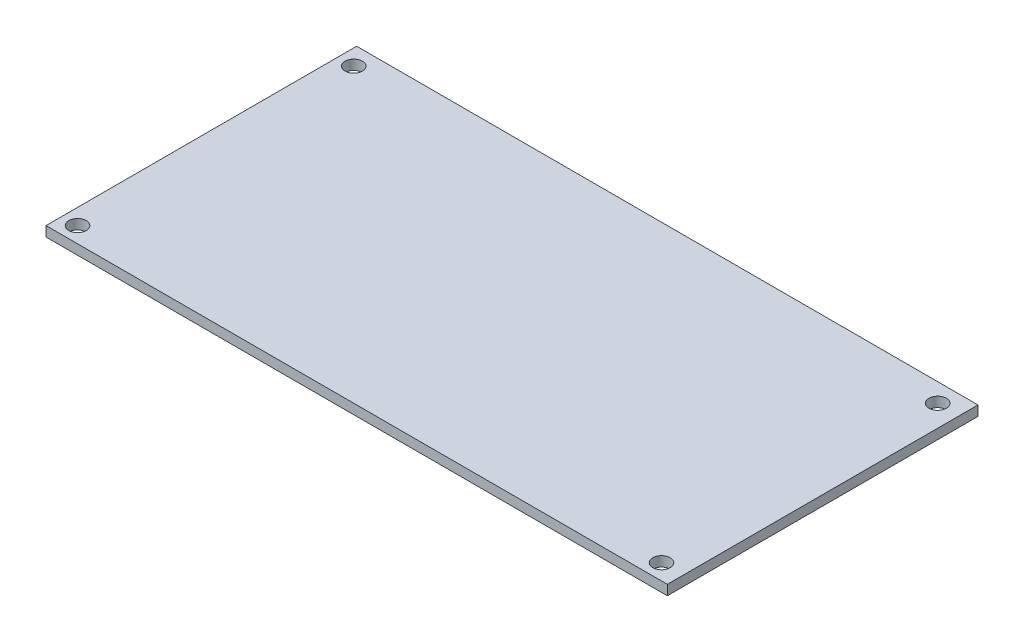
ISO-10303-21;
HEADER;
FILE_DESCRIPTION(('STEP AP214'),'2;1');
FILE_NAME('part.step','',(''),(''),'','','');
FILE_SCHEMA(('AUTOMOTIVE_DESIGN { 1 0 10303 214 1 1 1 1 }'));
ENDSEC;
DATA;
#1=APPLICATION_CONTEXT('core data for automotive mechanical design processes');
#2=APPLICATION_PROTOCOL_DEFINITION('international standard','automotive_design',2000,#1);
#3=PRODUCT_CONTEXT('',#1,'mechanical');
#4=PRODUCT('Part','Part','',(#3));
#5=PRODUCT_RELATED_PRODUCT_CATEGORY('part','',(#4));
#6=PRODUCT_DEFINITION_FORMATION('','',#4);
#7=PRODUCT_DEFINITION_CONTEXT('part definition',#1,'design');
#8=PRODUCT_DEFINITION('design','',#6,#7);
#9=PRODUCT_DEFINITION_SHAPE('','',#8);
#10=(LENGTH_UNIT() NAMED_UNIT(*) SI_UNIT(.MILLI.,.METRE.));
#11=(NAMED_UNIT(*) PLANE_ANGLE_UNIT() SI_UNIT($,.RADIAN.));
#12=(NAMED_UNIT(*) SI_UNIT($,.STERADIAN.) SOLID_ANGLE_UNIT());
#13=UNCERTAINTY_MEASURE_WITH_UNIT(LENGTH_MEASURE(1.E-05),#10,'distance_accuracy_value','');
#14=(GEOMETRIC_REPRESENTATION_CONTEXT(3) GLOBAL_UNCERTAINTY_ASSIGNED_CONTEXT((#13)) GLOBAL_UNIT_ASSIGNED_CONTEXT((#10,
#11,#12)) REPRESENTATION_CONTEXT('',''));
#15=CARTESIAN_POINT('',(0.,0.,0.));
#16=DIRECTION('',(0.,0.,1.));
#17=DIRECTION('',(1.,0.,0.));
#18=AXIS2_PLACEMENT_3D('',#15,#16,#17);
#19=CARTESIAN_POINT('',(0.,1.6,0.));
#20=DIRECTION('',(0.,1.,0.));
#21=DIRECTION('',(0.,0.,1.));
#22=AXIS2_PLACEMENT_3D('',#19,#20,#21);
#23=PLANE('',#22);
#24=CARTESIAN_POINT('',(58.5956714014574,1.6,21.3006729412988));
#25=DIRECTION('',(0.,1.,0.));
#26=DIRECTION('',(0.,0.,1.));
#27=AXIS2_PLACEMENT_3D('',#24,#25,#26);
#28=CIRCLE('',#27,1.39700000000001);
#29=CARTESIAN_POINT('',(58.5956714014574,1.6,22.6976729412988));
#30=VERTEX_POINT('',#29);
#31=EDGE_CURVE('E121',#30,#30,#28,.T.);
#32=ORIENTED_EDGE('',*,*,#31,.F.);
#33=EDGE_LOOP('',(#32));
#34=FACE_BOUND('',#33,.T.);
#35=CARTESIAN_POINT('',(-35.3843285985426,1.6,-23.1493270587012));
#36=DIRECTION('',(0.,1.,0.));
#37=DIRECTION('',(0.,0.,1.));
#38=AXIS2_PLACEMENT_3D('',#35,#36,#37);
#39=CIRCLE('',#38,1.39700000000001);
#40=CARTESIAN_POINT('',(-35.3843285985426,1.6,-21.7523270587012));
#41=VERTEX_POINT('',#40);
#42=EDGE_CURVE('E100',#41,#41,#39,.T.);
#43=ORIENTED_EDGE('',*,*,#42,.F.);
#44=EDGE_LOOP('',(#43));
#45=FACE_BOUND('',#44,.T.);
#46=DIRECTION('',(0.,0.,1.));
#47=VECTOR('',#46,1.);
#48=CARTESIAN_POINT('',(-37.9243285985426,1.6,-26.1593270587012));
#49=LINE('',#48,#47);
#50=CARTESIAN_POINT('',(-37.9243285985426,1.6,-26.1593270587012));
#51=VERTEX_POINT('',#50);
#52=CARTESIAN_POINT('',(-37.9243285985426,1.6,23.8406729412988));
#53=VERTEX_POINT('',#52);
#54=EDGE_CURVE('E85',#51,#53,#49,.T.);
#55=ORIENTED_EDGE('',*,*,#54,.T.);
#56=DIRECTION('',(1.,0.,0.));
#57=VECTOR('',#56,1.);
#58=CARTESIAN_POINT('',(-37.9243285985426,1.6,23.8406729412988));
#59=LINE('',#58,#57);
#60=CARTESIAN_POINT('',(62.0756714014574,1.6,23.8406729412988));
#61=VERTEX_POINT('',#60);
#62=EDGE_CURVE('E80',#53,#61,#59,.T.);
#63=ORIENTED_EDGE('',*,*,#62,.T.);
#64=DIRECTION('',(0.,0.,-1.));
#65=VECTOR('',#64,1.);
#66=CARTESIAN_POINT('',(62.0756714014574,1.6,-26.1593270587012));
#67=LINE('',#66,#65);
#68=CARTESIAN_POINT('',(62.0756714014574,1.6,-26.1593270587012));
#69=VERTEX_POINT('',#68);
#70=EDGE_CURVE('E83',#61,#69,#67,.T.);
#71=ORIENTED_EDGE('',*,*,#70,.T.);
#72=DIRECTION('',(-1.,0.,0.));
#73=VECTOR('',#72,1.);
#74=CARTESIAN_POINT('',(-37.9243285985426,1.6,-26.1593270587012));
#75=LINE('',#74,#73);
#76=EDGE_CURVE('E50',#69,#51,#75,.T.);
#77=ORIENTED_EDGE('',*,*,#76,.T.);
#78=EDGE_LOOP('',(#55,#63,#71,#77));
#79=FACE_BOUND('',#78,.T.);
#80=CARTESIAN_POINT('',(-35.3843285985426,1.6,21.3006729412988));
#81=DIRECTION('',(0.,1.,0.));
#82=DIRECTION('',(0.,0.,1.));
#83=AXIS2_PLACEMENT_3D('',#80,#81,#82);
#84=CIRCLE('',#83,1.39700000000001);
#85=CARTESIAN_POINT('',(-35.3843285985426,1.6,22.6976729412988));
#86=VERTEX_POINT('',#85);
#87=EDGE_CURVE('E115',#86,#86,#84,.T.);
#88=ORIENTED_EDGE('',*,*,#87,.F.);
#89=EDGE_LOOP('',(#88));
#90=FACE_BOUND('',#89,.T.);
#91=CARTESIAN_POINT('',(58.5956714014574,1.6,-23.1493270587012));
#92=DIRECTION('',(0.,1.,0.));
#93=DIRECTION('',(0.,0.,1.));
#94=AXIS2_PLACEMENT_3D('',#91,#92,#93);
#95=CIRCLE('',#94,1.39700000000001);
#96=CARTESIAN_POINT('',(58.5956714014574,1.6,-21.7523270587012));
#97=VERTEX_POINT('',#96);
#98=EDGE_CURVE('E127',#97,#97,#95,.T.);
#99=ORIENTED_EDGE('',*,*,#98,.F.);
#100=EDGE_LOOP('',(#99));
#101=FACE_BOUND('',#100,.T.);
#102=ADVANCED_FACE('F33',(#34,#45,#79,#90,#101),#23,.T.);
#103=CARTESIAN_POINT('',(0.,0.,0.));
#104=DIRECTION('',(0.,1.,0.));
#105=DIRECTION('',(0.,0.,1.));
#106=AXIS2_PLACEMENT_3D('',#103,#104,#105);
#107=PLANE('',#106);
#108=CARTESIAN_POINT('',(58.5956714014574,0.,21.3006729412988));
#109=DIRECTION('',(0.,1.,0.));
#110=DIRECTION('',(0.,0.,1.));
#111=AXIS2_PLACEMENT_3D('',#108,#109,#110);
#112=CIRCLE('',#111,1.39700000000001);
#113=CARTESIAN_POINT('',(58.5956714014574,0.,22.6976729412988));
#114=VERTEX_POINT('',#113);
#115=EDGE_CURVE('E124',#114,#114,#112,.T.);
#116=ORIENTED_EDGE('',*,*,#115,.T.);
#117=EDGE_LOOP('',(#116));
#118=FACE_BOUND('',#117,.T.);
#119=CARTESIAN_POINT('',(-35.3843285985426,0.,-23.1493270587012));
#120=DIRECTION('',(0.,1.,0.));
#121=DIRECTION('',(0.,0.,1.));
#122=AXIS2_PLACEMENT_3D('',#119,#120,#121);
#123=CIRCLE('',#122,1.39700000000001);
#124=CARTESIAN_POINT('',(-35.3843285985426,0.,-21.7523270587012));
#125=VERTEX_POINT('',#124);
#126=EDGE_CURVE('E112',#125,#125,#123,.T.);
#127=ORIENTED_EDGE('',*,*,#126,.T.);
#128=EDGE_LOOP('',(#127));
#129=FACE_BOUND('',#128,.T.);
#130=DIRECTION('',(0.,0.,1.));
#131=VECTOR('',#130,1.);
#132=CARTESIAN_POINT('',(-37.9243285985426,0.,-26.1593270587012));
#133=LINE('',#132,#131);
#134=CARTESIAN_POINT('',(-37.9243285985426,0.,-26.1593270587012));
#135=VERTEX_POINT('',#134);
#136=CARTESIAN_POINT('',(-37.9243285985426,0.,23.8406729412988));
#137=VERTEX_POINT('',#136);
#138=EDGE_CURVE('E97',#135,#137,#133,.T.);
#139=ORIENTED_EDGE('',*,*,#138,.F.);
#140=DIRECTION('',(-1.,0.,0.));
#141=VECTOR('',#140,1.);
#142=CARTESIAN_POINT('',(-37.9243285985426,0.,-26.1593270587012));
#143=LINE('',#142,#141);
#144=CARTESIAN_POINT('',(62.0756714014574,0.,-26.1593270587012));
#145=VERTEX_POINT('',#144);
#146=EDGE_CURVE('E73',#145,#135,#143,.T.);
#147=ORIENTED_EDGE('',*,*,#146,.F.);
#148=DIRECTION('',(0.,0.,-1.));
#149=VECTOR('',#148,1.);
#150=CARTESIAN_POINT('',(62.0756714014574,0.,-26.1593270587012));
#151=LINE('',#150,#149);
#152=CARTESIAN_POINT('',(62.0756714014574,0.,23.8406729412988));
#153=VERTEX_POINT('',#152);
#154=EDGE_CURVE('E67',#153,#145,#151,.T.);
#155=ORIENTED_EDGE('',*,*,#154,.F.);
#156=DIRECTION('',(1.,0.,0.));
#157=VECTOR('',#156,1.);
#158=CARTESIAN_POINT('',(-37.9243285985426,0.,23.8406729412988));
#159=LINE('',#158,#157);
#160=EDGE_CURVE('E89',#137,#153,#159,.T.);
#161=ORIENTED_EDGE('',*,*,#160,.F.);
#162=EDGE_LOOP('',(#139,#147,#155,#161));
#163=FACE_BOUND('',#162,.T.);
#164=CARTESIAN_POINT('',(-35.3843285985426,0.,21.3006729412988));
#165=DIRECTION('',(0.,1.,0.));
#166=DIRECTION('',(0.,0.,1.));
#167=AXIS2_PLACEMENT_3D('',#164,#165,#166);
#168=CIRCLE('',#167,1.39700000000001);
#169=CARTESIAN_POINT('',(-35.3843285985426,0.,22.6976729412988));
#170=VERTEX_POINT('',#169);
#171=EDGE_CURVE('E118',#170,#170,#168,.T.);
#172=ORIENTED_EDGE('',*,*,#171,.T.);
#173=EDGE_LOOP('',(#172));
#174=FACE_BOUND('',#173,.T.);
#175=CARTESIAN_POINT('',(58.5956714014574,0.,-23.1493270587012));
#176=DIRECTION('',(0.,1.,0.));
#177=DIRECTION('',(0.,0.,1.));
#178=AXIS2_PLACEMENT_3D('',#175,#176,#177);
#179=CIRCLE('',#178,1.39700000000001);
#180=CARTESIAN_POINT('',(58.5956714014574,0.,-21.7523270587012));
#181=VERTEX_POINT('',#180);
#182=EDGE_CURVE('E130',#181,#181,#179,.T.);
#183=ORIENTED_EDGE('',*,*,#182,.T.);
#184=EDGE_LOOP('',(#183));
#185=FACE_BOUND('',#184,.T.);
#186=ADVANCED_FACE('F108',(#118,#129,#163,#174,#185),#107,.F.);
#187=CARTESIAN_POINT('',(-37.9243285985426,1.6,-26.1593270587012));
#188=DIRECTION('',(1.,0.,0.));
#189=DIRECTION('',(0.,0.,-1.));
#190=AXIS2_PLACEMENT_3D('',#187,#188,#189);
#191=PLANE('',#190);
#192=ORIENTED_EDGE('',*,*,#138,.T.);
#193=DIRECTION('',(0.,-1.,0.));
#194=VECTOR('',#193,1.);
#195=CARTESIAN_POINT('',(-37.9243285985426,1.6,23.8406729412988));
#196=LINE('',#195,#194);
#197=EDGE_CURVE('E11',#53,#137,#196,.T.);
#198=ORIENTED_EDGE('',*,*,#197,.F.);
#199=ORIENTED_EDGE('',*,*,#54,.F.);
#200=DIRECTION('',(0.,-1.,0.));
#201=VECTOR('',#200,1.);
#202=CARTESIAN_POINT('',(-37.9243285985426,1.6,-26.1593270587012));
#203=LINE('',#202,#201);
#204=EDGE_CURVE('E93',#51,#135,#203,.T.);
#205=ORIENTED_EDGE('',*,*,#204,.T.);
#206=EDGE_LOOP('',(#192,#198,#199,#205));
#207=FACE_BOUND('',#206,.T.);
#208=ADVANCED_FACE('F35',(#207),#191,.F.);
#209=CARTESIAN_POINT('',(-37.9243285985426,1.6,23.8406729412988));
#210=DIRECTION('',(0.,0.,-1.));
#211=DIRECTION('',(-1.,0.,0.));
#212=AXIS2_PLACEMENT_3D('',#209,#210,#211);
#213=PLANE('',#212);
#214=ORIENTED_EDGE('',*,*,#160,.T.);
#215=DIRECTION('',(0.,-1.,0.));
#216=VECTOR('',#215,1.);
#217=CARTESIAN_POINT('',(62.0756714014574,1.6,23.8406729412988));
#218=LINE('',#217,#216);
#219=EDGE_CURVE('E42',#61,#153,#218,.T.);
#220=ORIENTED_EDGE('',*,*,#219,.F.);
#221=ORIENTED_EDGE('',*,*,#62,.F.);
#222=ORIENTED_EDGE('',*,*,#197,.T.);
#223=EDGE_LOOP('',(#214,#220,#221,#222));
#224=FACE_BOUND('',#223,.T.);
#225=ADVANCED_FACE('F88',(#224),#213,.F.);
#226=CARTESIAN_POINT('',(62.0756714014574,1.6,-26.1593270587012));
#227=DIRECTION('',(-1.,0.,0.));
#228=DIRECTION('',(0.,0.,1.));
#229=AXIS2_PLACEMENT_3D('',#226,#227,#228);
#230=PLANE('',#229);
#231=ORIENTED_EDGE('',*,*,#154,.T.);
#232=DIRECTION('',(0.,-1.,0.));
#233=VECTOR('',#232,1.);
#234=CARTESIAN_POINT('',(62.0756714014574,1.6,-26.1593270587012));
#235=LINE('',#234,#233);
#236=EDGE_CURVE('E90',#69,#145,#235,.T.);
#237=ORIENTED_EDGE('',*,*,#236,.F.);
#238=ORIENTED_EDGE('',*,*,#70,.F.);
#239=ORIENTED_EDGE('',*,*,#219,.T.);
#240=EDGE_LOOP('',(#231,#237,#238,#239));
#241=FACE_BOUND('',#240,.T.);
#242=ADVANCED_FACE('F91',(#241),#230,.F.);
#243=CARTESIAN_POINT('',(-37.9243285985426,1.6,-26.1593270587012));
#244=DIRECTION('',(0.,0.,1.));
#245=DIRECTION('',(1.,0.,0.));
#246=AXIS2_PLACEMENT_3D('',#243,#244,#245);
#247=PLANE('',#246);
#248=ORIENTED_EDGE('',*,*,#146,.T.);
#249=ORIENTED_EDGE('',*,*,#204,.F.);
#250=ORIENTED_EDGE('',*,*,#76,.F.);
#251=ORIENTED_EDGE('',*,*,#236,.T.);
#252=EDGE_LOOP('',(#248,#249,#250,#251));
#253=FACE_BOUND('',#252,.T.);
#254=ADVANCED_FACE('F105',(#253),#247,.F.);
#255=CARTESIAN_POINT('',(-35.3843285985426,1.6,-23.1493270587012));
#256=DIRECTION('',(0.,-1.,0.));
#257=DIRECTION('',(0.,0.,-1.));
#258=AXIS2_PLACEMENT_3D('',#255,#256,#257);
#259=CYLINDRICAL_SURFACE('',#258,1.39700000000001);
#260=ORIENTED_EDGE('',*,*,#42,.T.);
#261=EDGE_LOOP('',(#260));
#262=FACE_BOUND('',#261,.T.);
#263=ORIENTED_EDGE('',*,*,#126,.F.);
#264=EDGE_LOOP('',(#263));
#265=FACE_BOUND('',#264,.T.);
#266=ADVANCED_FACE('F150',(#262,#265),#259,.F.);
#267=CARTESIAN_POINT('',(-35.3843285985426,1.6,21.3006729412988));
#268=DIRECTION('',(0.,-1.,0.));
#269=DIRECTION('',(0.,0.,-1.));
#270=AXIS2_PLACEMENT_3D('',#267,#268,#269);
#271=CYLINDRICAL_SURFACE('',#270,1.39700000000001);
#272=ORIENTED_EDGE('',*,*,#87,.T.);
#273=EDGE_LOOP('',(#272));
#274=FACE_BOUND('',#273,.T.);
#275=ORIENTED_EDGE('',*,*,#171,.F.);
#276=EDGE_LOOP('',(#275));
#277=FACE_BOUND('',#276,.T.);
#278=ADVANCED_FACE('F196',(#274,#277),#271,.F.);
#279=CARTESIAN_POINT('',(58.5956714014574,1.6,21.3006729412988));
#280=DIRECTION('',(0.,-1.,0.));
#281=DIRECTION('',(0.,0.,-1.));
#282=AXIS2_PLACEMENT_3D('',#279,#280,#281);
#283=CYLINDRICAL_SURFACE('',#282,1.39700000000001);
#284=ORIENTED_EDGE('',*,*,#31,.T.);
#285=EDGE_LOOP('',(#284));
#286=FACE_BOUND('',#285,.T.);
#287=ORIENTED_EDGE('',*,*,#115,.F.);
#288=EDGE_LOOP('',(#287));
#289=FACE_BOUND('',#288,.T.);
#290=ADVANCED_FACE('F204',(#286,#289),#283,.F.);
#291=CARTESIAN_POINT('',(58.5956714014574,1.6,-23.1493270587012));
#292=DIRECTION('',(0.,-1.,0.));
#293=DIRECTION('',(0.,0.,-1.));
#294=AXIS2_PLACEMENT_3D('',#291,#292,#293);
#295=CYLINDRICAL_SURFACE('',#294,1.39700000000001);
#296=ORIENTED_EDGE('',*,*,#98,.T.);
#297=EDGE_LOOP('',(#296));
#298=FACE_BOUND('',#297,.T.);
#299=ORIENTED_EDGE('',*,*,#182,.F.);
#300=EDGE_LOOP('',(#299));
#301=FACE_BOUND('',#300,.T.);
#302=ADVANCED_FACE('F136',(#298,#301),#295,.F.);
#303=CLOSED_SHELL('',(#102,#186,#208,#225,#242,#254,#266,#278,#290,#302));
#304=MANIFOLD_SOLID_BREP('B2',#303);
#305=ADVANCED_BREP_SHAPE_REPRESENTATION('',(#18,#304),#14);
#306=SHAPE_DEFINITION_REPRESENTATION(#9,#305);
ENDSEC;
END-ISO-10303-21;
